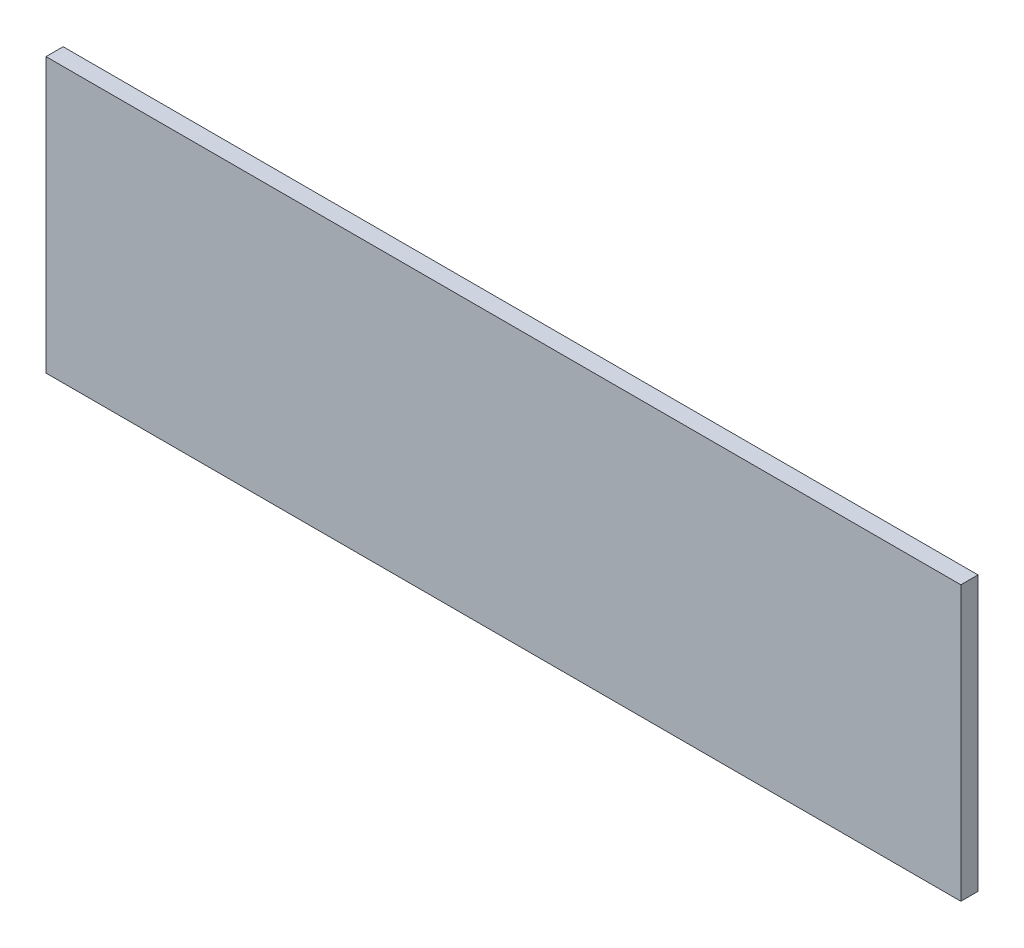
ISO-10303-21;
HEADER;
FILE_DESCRIPTION(('STEP AP214'),'2;1');
FILE_NAME('part.step','',(''),(''),'','','');
FILE_SCHEMA(('AUTOMOTIVE_DESIGN { 1 0 10303 214 1 1 1 1 }'));
ENDSEC;
DATA;
#1=APPLICATION_CONTEXT('core data for automotive mechanical design processes');
#2=APPLICATION_PROTOCOL_DEFINITION('international standard','automotive_design',2000,#1);
#3=PRODUCT_CONTEXT('',#1,'mechanical');
#4=PRODUCT('Part','Part','',(#3));
#5=PRODUCT_RELATED_PRODUCT_CATEGORY('part','',(#4));
#6=PRODUCT_DEFINITION_FORMATION('','',#4);
#7=PRODUCT_DEFINITION_CONTEXT('part definition',#1,'design');
#8=PRODUCT_DEFINITION('design','',#6,#7);
#9=PRODUCT_DEFINITION_SHAPE('','',#8);
#10=(LENGTH_UNIT() NAMED_UNIT(*) SI_UNIT(.MILLI.,.METRE.));
#11=(NAMED_UNIT(*) PLANE_ANGLE_UNIT() SI_UNIT($,.RADIAN.));
#12=(NAMED_UNIT(*) SI_UNIT($,.STERADIAN.) SOLID_ANGLE_UNIT());
#13=UNCERTAINTY_MEASURE_WITH_UNIT(LENGTH_MEASURE(1.E-05),#10,'distance_accuracy_value','');
#14=(GEOMETRIC_REPRESENTATION_CONTEXT(3) GLOBAL_UNCERTAINTY_ASSIGNED_CONTEXT((#13)) GLOBAL_UNIT_ASSIGNED_CONTEXT((#10,
#11,#12)) REPRESENTATION_CONTEXT('',''));
#15=CARTESIAN_POINT('',(0.,0.,0.));
#16=DIRECTION('',(0.,0.,1.));
#17=DIRECTION('',(1.,0.,0.));
#18=AXIS2_PLACEMENT_3D('',#15,#16,#17);
#19=CARTESIAN_POINT('',(133.5,40.,5.));
#20=DIRECTION('',(-1.,0.,0.));
#21=DIRECTION('',(0.,-1.,0.));
#22=AXIS2_PLACEMENT_3D('',#19,#20,#21);
#23=PLANE('',#22);
#24=DIRECTION('',(0.,1.,0.));
#25=VECTOR('',#24,1.);
#26=CARTESIAN_POINT('',(133.5,40.,0.));
#27=LINE('',#26,#25);
#28=CARTESIAN_POINT('',(133.5,-40.,0.));
#29=VERTEX_POINT('',#28);
#30=CARTESIAN_POINT('',(133.5,40.,0.));
#31=VERTEX_POINT('',#30);
#32=EDGE_CURVE('E104',#29,#31,#27,.T.);
#33=ORIENTED_EDGE('',*,*,#32,.T.);
#34=DIRECTION('',(0.,0.,-1.));
#35=VECTOR('',#34,1.);
#36=CARTESIAN_POINT('',(133.5,40.,5.));
#37=LINE('',#36,#35);
#38=CARTESIAN_POINT('',(133.5,40.,5.));
#39=VERTEX_POINT('',#38);
#40=EDGE_CURVE('E11',#39,#31,#37,.T.);
#41=ORIENTED_EDGE('',*,*,#40,.F.);
#42=DIRECTION('',(0.,1.,0.));
#43=VECTOR('',#42,1.);
#44=CARTESIAN_POINT('',(133.5,40.,5.));
#45=LINE('',#44,#43);
#46=CARTESIAN_POINT('',(133.5,-40.,5.));
#47=VERTEX_POINT('',#46);
#48=EDGE_CURVE('E92',#47,#39,#45,.T.);
#49=ORIENTED_EDGE('',*,*,#48,.F.);
#50=DIRECTION('',(0.,0.,-1.));
#51=VECTOR('',#50,1.);
#52=CARTESIAN_POINT('',(133.5,-40.,5.));
#53=LINE('',#52,#51);
#54=EDGE_CURVE('E100',#47,#29,#53,.T.);
#55=ORIENTED_EDGE('',*,*,#54,.T.);
#56=EDGE_LOOP('',(#33,#41,#49,#55));
#57=FACE_BOUND('',#56,.T.);
#58=ADVANCED_FACE('F41',(#57),#23,.F.);
#59=CARTESIAN_POINT('',(-133.5,40.,5.));
#60=DIRECTION('',(0.,-1.,0.));
#61=DIRECTION('',(0.,0.,-1.));
#62=AXIS2_PLACEMENT_3D('',#59,#60,#61);
#63=PLANE('',#62);
#64=DIRECTION('',(-1.,0.,0.));
#65=VECTOR('',#64,1.);
#66=CARTESIAN_POINT('',(-133.5,40.,0.));
#67=LINE('',#66,#65);
#68=CARTESIAN_POINT('',(-133.5,40.,0.));
#69=VERTEX_POINT('',#68);
#70=EDGE_CURVE('E96',#31,#69,#67,.T.);
#71=ORIENTED_EDGE('',*,*,#70,.T.);
#72=DIRECTION('',(0.,0.,-1.));
#73=VECTOR('',#72,1.);
#74=CARTESIAN_POINT('',(-133.5,40.,5.));
#75=LINE('',#74,#73);
#76=CARTESIAN_POINT('',(-133.5,40.,5.));
#77=VERTEX_POINT('',#76);
#78=EDGE_CURVE('E49',#77,#69,#75,.T.);
#79=ORIENTED_EDGE('',*,*,#78,.F.);
#80=DIRECTION('',(-1.,0.,0.));
#81=VECTOR('',#80,1.);
#82=CARTESIAN_POINT('',(-133.5,40.,5.));
#83=LINE('',#82,#81);
#84=EDGE_CURVE('E87',#39,#77,#83,.T.);
#85=ORIENTED_EDGE('',*,*,#84,.F.);
#86=ORIENTED_EDGE('',*,*,#40,.T.);
#87=EDGE_LOOP('',(#71,#79,#85,#86));
#88=FACE_BOUND('',#87,.T.);
#89=ADVANCED_FACE('F95',(#88),#63,.F.);
#90=CARTESIAN_POINT('',(-133.5,40.,5.));
#91=DIRECTION('',(1.,0.,0.));
#92=DIRECTION('',(0.,1.,0.));
#93=AXIS2_PLACEMENT_3D('',#90,#91,#92);
#94=PLANE('',#93);
#95=DIRECTION('',(0.,-1.,0.));
#96=VECTOR('',#95,1.);
#97=CARTESIAN_POINT('',(-133.5,40.,0.));
#98=LINE('',#97,#96);
#99=CARTESIAN_POINT('',(-133.5,-40.,0.));
#100=VERTEX_POINT('',#99);
#101=EDGE_CURVE('E74',#69,#100,#98,.T.);
#102=ORIENTED_EDGE('',*,*,#101,.T.);
#103=DIRECTION('',(0.,0.,-1.));
#104=VECTOR('',#103,1.);
#105=CARTESIAN_POINT('',(-133.5,-40.,5.));
#106=LINE('',#105,#104);
#107=CARTESIAN_POINT('',(-133.5,-40.,5.));
#108=VERTEX_POINT('',#107);
#109=EDGE_CURVE('E97',#108,#100,#106,.T.);
#110=ORIENTED_EDGE('',*,*,#109,.F.);
#111=DIRECTION('',(0.,-1.,0.));
#112=VECTOR('',#111,1.);
#113=CARTESIAN_POINT('',(-133.5,40.,5.));
#114=LINE('',#113,#112);
#115=EDGE_CURVE('E90',#77,#108,#114,.T.);
#116=ORIENTED_EDGE('',*,*,#115,.F.);
#117=ORIENTED_EDGE('',*,*,#78,.T.);
#118=EDGE_LOOP('',(#102,#110,#116,#117));
#119=FACE_BOUND('',#118,.T.);
#120=ADVANCED_FACE('F98',(#119),#94,.F.);
#121=CARTESIAN_POINT('',(-133.5,-40.,5.));
#122=DIRECTION('',(0.,1.,0.));
#123=DIRECTION('',(0.,0.,1.));
#124=AXIS2_PLACEMENT_3D('',#121,#122,#123);
#125=PLANE('',#124);
#126=DIRECTION('',(1.,0.,0.));
#127=VECTOR('',#126,1.);
#128=CARTESIAN_POINT('',(-133.5,-40.,0.));
#129=LINE('',#128,#127);
#130=EDGE_CURVE('E80',#100,#29,#129,.T.);
#131=ORIENTED_EDGE('',*,*,#130,.T.);
#132=ORIENTED_EDGE('',*,*,#54,.F.);
#133=DIRECTION('',(1.,0.,0.));
#134=VECTOR('',#133,1.);
#135=CARTESIAN_POINT('',(-133.5,-40.,5.));
#136=LINE('',#135,#134);
#137=EDGE_CURVE('E57',#108,#47,#136,.T.);
#138=ORIENTED_EDGE('',*,*,#137,.F.);
#139=ORIENTED_EDGE('',*,*,#109,.T.);
#140=EDGE_LOOP('',(#131,#132,#138,#139));
#141=FACE_BOUND('',#140,.T.);
#142=ADVANCED_FACE('F111',(#141),#125,.F.);
#143=CARTESIAN_POINT('',(0.,0.,5.));
#144=DIRECTION('',(0.,0.,1.));
#145=DIRECTION('',(1.,0.,0.));
#146=AXIS2_PLACEMENT_3D('',#143,#144,#145);
#147=PLANE('',#146);
#148=ORIENTED_EDGE('',*,*,#48,.T.);
#149=ORIENTED_EDGE('',*,*,#84,.T.);
#150=ORIENTED_EDGE('',*,*,#115,.T.);
#151=ORIENTED_EDGE('',*,*,#137,.T.);
#152=EDGE_LOOP('',(#148,#149,#150,#151));
#153=FACE_BOUND('',#152,.T.);
#154=ADVANCED_FACE('F88',(#153),#147,.T.);
#155=CARTESIAN_POINT('',(0.,0.,0.));
#156=DIRECTION('',(0.,0.,1.));
#157=DIRECTION('',(1.,0.,0.));
#158=AXIS2_PLACEMENT_3D('',#155,#156,#157);
#159=PLANE('',#158);
#160=ORIENTED_EDGE('',*,*,#32,.F.);
#161=ORIENTED_EDGE('',*,*,#130,.F.);
#162=ORIENTED_EDGE('',*,*,#101,.F.);
#163=ORIENTED_EDGE('',*,*,#70,.F.);
#164=EDGE_LOOP('',(#160,#161,#162,#163));
#165=FACE_BOUND('',#164,.T.);
#166=ADVANCED_FACE('F114',(#165),#159,.F.);
#167=CLOSED_SHELL('',(#58,#89,#120,#142,#154,#166));
#168=MANIFOLD_SOLID_BREP('B2',#167);
#169=ADVANCED_BREP_SHAPE_REPRESENTATION('',(#18,#168),#14);
#170=SHAPE_DEFINITION_REPRESENTATION(#9,#169);
ENDSEC;
END-ISO-10303-21;
